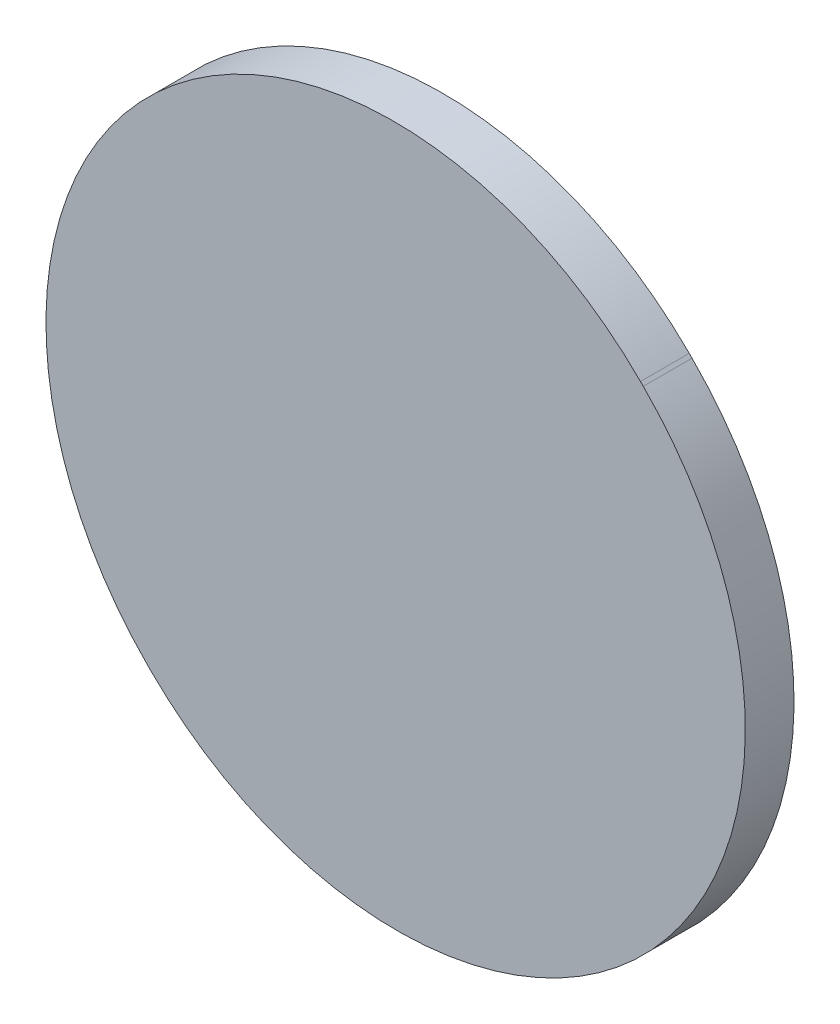
ISO-10303-21;
HEADER;
FILE_DESCRIPTION(('STEP AP214'),'2;1');
FILE_NAME('part.step','',(''),(''),'','','');
FILE_SCHEMA(('AUTOMOTIVE_DESIGN { 1 0 10303 214 1 1 1 1 }'));
ENDSEC;
DATA;
#1=APPLICATION_CONTEXT('core data for automotive mechanical design processes');
#2=APPLICATION_PROTOCOL_DEFINITION('international standard','automotive_design',2000,#1);
#3=PRODUCT_CONTEXT('',#1,'mechanical');
#4=PRODUCT('Part','Part','',(#3));
#5=PRODUCT_RELATED_PRODUCT_CATEGORY('part','',(#4));
#6=PRODUCT_DEFINITION_FORMATION('','',#4);
#7=PRODUCT_DEFINITION_CONTEXT('part definition',#1,'design');
#8=PRODUCT_DEFINITION('design','',#6,#7);
#9=PRODUCT_DEFINITION_SHAPE('','',#8);
#10=(LENGTH_UNIT() NAMED_UNIT(*) SI_UNIT(.MILLI.,.METRE.));
#11=(NAMED_UNIT(*) PLANE_ANGLE_UNIT() SI_UNIT($,.RADIAN.));
#12=(NAMED_UNIT(*) SI_UNIT($,.STERADIAN.) SOLID_ANGLE_UNIT());
#13=UNCERTAINTY_MEASURE_WITH_UNIT(LENGTH_MEASURE(1.E-05),#10,'distance_accuracy_value','');
#14=(GEOMETRIC_REPRESENTATION_CONTEXT(3) GLOBAL_UNCERTAINTY_ASSIGNED_CONTEXT((#13)) GLOBAL_UNIT_ASSIGNED_CONTEXT((#10,
#11,#12)) REPRESENTATION_CONTEXT('',''));
#15=CARTESIAN_POINT('',(0.,0.,0.));
#16=DIRECTION('',(0.,0.,1.));
#17=DIRECTION('',(1.,0.,0.));
#18=AXIS2_PLACEMENT_3D('',#15,#16,#17);
#19=CARTESIAN_POINT('',(132.133223,-112.724776,1.635));
#20=DIRECTION('',(0.,0.,1.));
#21=DIRECTION('',(1.,0.,0.));
#22=AXIS2_PLACEMENT_3D('',#19,#20,#21);
#23=PLANE('',#22);
#24=DIRECTION('',(0.707106781189048,-0.707106781184048,0.));
#25=VECTOR('',#24,1.);
#26=CARTESIAN_POINT('',(132.133223,-112.724776,1.635));
#27=LINE('',#26,#25);
#28=CARTESIAN_POINT('',(132.133223,-112.724776,1.635));
#29=VERTEX_POINT('',#28);
#30=CARTESIAN_POINT('',(132.135223,-112.726776,1.635));
#31=VERTEX_POINT('',#30);
#32=EDGE_CURVE('E95',#29,#31,#27,.T.);
#33=ORIENTED_EDGE('',*,*,#32,.T.);
#34=CARTESIAN_POINT('',(132.3119995,-112.5499995,1.635));
#35=DIRECTION('',(0.,0.,1.));
#36=DIRECTION('',(-0.707106781186548,-0.707106781186548,0.));
#37=AXIS2_PLACEMENT_3D('',#34,#35,#36);
#38=CIRCLE('',#37,0.249999723809);
#39=CARTESIAN_POINT('',(132.488776,-112.373223,1.635));
#40=VERTEX_POINT('',#39);
#41=EDGE_CURVE('E90',#31,#40,#38,.T.);
#42=ORIENTED_EDGE('',*,*,#41,.T.);
#43=DIRECTION('',(-0.707106781189048,0.707106781184048,0.));
#44=VECTOR('',#43,1.);
#45=CARTESIAN_POINT('',(132.488776,-112.373223,1.635));
#46=LINE('',#45,#44);
#47=CARTESIAN_POINT('',(132.486776,-112.371223,1.635));
#48=VERTEX_POINT('',#47);
#49=EDGE_CURVE('E57',#40,#48,#46,.T.);
#50=ORIENTED_EDGE('',*,*,#49,.T.);
#51=CARTESIAN_POINT('',(132.3099995,-112.5479995,1.635));
#52=DIRECTION('',(0.,0.,1.));
#53=DIRECTION('',(0.707106781186548,0.707106781186548,0.));
#54=AXIS2_PLACEMENT_3D('',#51,#52,#53);
#55=CIRCLE('',#54,0.249999723809);
#56=EDGE_CURVE('E11',#48,#29,#55,.T.);
#57=ORIENTED_EDGE('',*,*,#56,.T.);
#58=EDGE_LOOP('',(#33,#42,#50,#57));
#59=FACE_BOUND('',#58,.T.);
#60=ADVANCED_FACE('F17',(#59),#23,.T.);
#61=CARTESIAN_POINT('',(132.133223,-112.724776,1.6));
#62=DIRECTION('',(0.,0.,1.));
#63=DIRECTION('',(1.,0.,0.));
#64=AXIS2_PLACEMENT_3D('',#61,#62,#63);
#65=PLANE('',#64);
#66=CARTESIAN_POINT('',(132.3099995,-112.5479995,1.6));
#67=DIRECTION('',(0.,0.,1.));
#68=DIRECTION('',(0.707106781186548,0.707106781186548,0.));
#69=AXIS2_PLACEMENT_3D('',#66,#67,#68);
#70=CIRCLE('',#69,0.249999723809);
#71=CARTESIAN_POINT('',(132.486776,-112.371223,1.6));
#72=VERTEX_POINT('',#71);
#73=CARTESIAN_POINT('',(132.133223,-112.724776,1.6));
#74=VERTEX_POINT('',#73);
#75=EDGE_CURVE('E26',#72,#74,#70,.T.);
#76=ORIENTED_EDGE('',*,*,#75,.F.);
#77=DIRECTION('',(-0.707106781189048,0.707106781184048,0.));
#78=VECTOR('',#77,1.);
#79=CARTESIAN_POINT('',(132.488776,-112.373223,1.6));
#80=LINE('',#79,#78);
#81=CARTESIAN_POINT('',(132.488776,-112.373223,1.6));
#82=VERTEX_POINT('',#81);
#83=EDGE_CURVE('E66',#82,#72,#80,.T.);
#84=ORIENTED_EDGE('',*,*,#83,.F.);
#85=CARTESIAN_POINT('',(132.3119995,-112.5499995,1.6));
#86=DIRECTION('',(0.,0.,1.));
#87=DIRECTION('',(-0.707106781186548,-0.707106781186548,0.));
#88=AXIS2_PLACEMENT_3D('',#85,#86,#87);
#89=CIRCLE('',#88,0.249999723809);
#90=CARTESIAN_POINT('',(132.135223,-112.726776,1.6));
#91=VERTEX_POINT('',#90);
#92=EDGE_CURVE('E76',#91,#82,#89,.T.);
#93=ORIENTED_EDGE('',*,*,#92,.F.);
#94=DIRECTION('',(0.707106781189048,-0.707106781184048,0.));
#95=VECTOR('',#94,1.);
#96=CARTESIAN_POINT('',(132.133223,-112.724776,1.6));
#97=LINE('',#96,#95);
#98=EDGE_CURVE('E80',#74,#91,#97,.T.);
#99=ORIENTED_EDGE('',*,*,#98,.F.);
#100=EDGE_LOOP('',(#76,#84,#93,#99));
#101=FACE_BOUND('',#100,.T.);
#102=ADVANCED_FACE('F78',(#101),#65,.F.);
#103=CARTESIAN_POINT('',(132.3099995,-112.5479995,1.6));
#104=DIRECTION('',(0.,0.,-1.));
#105=DIRECTION('',(0.707106781186548,0.707106781186548,0.));
#106=AXIS2_PLACEMENT_3D('',#103,#104,#105);
#107=CYLINDRICAL_SURFACE('',#106,0.249999723809);
#108=ORIENTED_EDGE('',*,*,#75,.T.);
#109=DIRECTION('',(0.,0.,1.));
#110=VECTOR('',#109,1.);
#111=CARTESIAN_POINT('',(132.133223,-112.724776,1.6));
#112=LINE('',#111,#110);
#113=EDGE_CURVE('E85',#74,#29,#112,.T.);
#114=ORIENTED_EDGE('',*,*,#113,.T.);
#115=ORIENTED_EDGE('',*,*,#56,.F.);
#116=DIRECTION('',(0.,0.,1.));
#117=VECTOR('',#116,1.);
#118=CARTESIAN_POINT('',(132.486776,-112.371223,1.6));
#119=LINE('',#118,#117);
#120=EDGE_CURVE('E104',#72,#48,#119,.T.);
#121=ORIENTED_EDGE('',*,*,#120,.F.);
#122=EDGE_LOOP('',(#108,#114,#115,#121));
#123=FACE_BOUND('',#122,.T.);
#124=ADVANCED_FACE('F180',(#123),#107,.T.);
#125=CARTESIAN_POINT('',(132.488776,-112.373223,1.6));
#126=DIRECTION('',(-0.707106781184048,-0.707106781189048,0.));
#127=DIRECTION('',(-0.707106781189048,0.707106781184048,0.));
#128=AXIS2_PLACEMENT_3D('',#125,#126,#127);
#129=PLANE('',#128);
#130=ORIENTED_EDGE('',*,*,#83,.T.);
#131=ORIENTED_EDGE('',*,*,#120,.T.);
#132=ORIENTED_EDGE('',*,*,#49,.F.);
#133=DIRECTION('',(0.,0.,1.));
#134=VECTOR('',#133,1.);
#135=CARTESIAN_POINT('',(132.488776,-112.373223,1.6));
#136=LINE('',#135,#134);
#137=EDGE_CURVE('E84',#82,#40,#136,.T.);
#138=ORIENTED_EDGE('',*,*,#137,.F.);
#139=EDGE_LOOP('',(#130,#131,#132,#138));
#140=FACE_BOUND('',#139,.T.);
#141=ADVANCED_FACE('F171',(#140),#129,.F.);
#142=CARTESIAN_POINT('',(132.3119995,-112.5499995,1.6));
#143=DIRECTION('',(0.,0.,-1.));
#144=DIRECTION('',(-0.707106781186548,-0.707106781186548,0.));
#145=AXIS2_PLACEMENT_3D('',#142,#143,#144);
#146=CYLINDRICAL_SURFACE('',#145,0.249999723809);
#147=ORIENTED_EDGE('',*,*,#92,.T.);
#148=ORIENTED_EDGE('',*,*,#137,.T.);
#149=ORIENTED_EDGE('',*,*,#41,.F.);
#150=DIRECTION('',(0.,0.,1.));
#151=VECTOR('',#150,1.);
#152=CARTESIAN_POINT('',(132.135223,-112.726776,1.6));
#153=LINE('',#152,#151);
#154=EDGE_CURVE('E88',#91,#31,#153,.T.);
#155=ORIENTED_EDGE('',*,*,#154,.F.);
#156=EDGE_LOOP('',(#147,#148,#149,#155));
#157=FACE_BOUND('',#156,.T.);
#158=ADVANCED_FACE('F89',(#157),#146,.T.);
#159=CARTESIAN_POINT('',(132.133223,-112.724776,1.6));
#160=DIRECTION('',(0.707106781184048,0.707106781189048,0.));
#161=DIRECTION('',(0.,0.,-1.));
#162=AXIS2_PLACEMENT_3D('',#159,#160,#161);
#163=PLANE('',#162);
#164=ORIENTED_EDGE('',*,*,#98,.T.);
#165=ORIENTED_EDGE('',*,*,#154,.T.);
#166=ORIENTED_EDGE('',*,*,#32,.F.);
#167=ORIENTED_EDGE('',*,*,#113,.F.);
#168=EDGE_LOOP('',(#164,#165,#166,#167));
#169=FACE_BOUND('',#168,.T.);
#170=ADVANCED_FACE('F97',(#169),#163,.F.);
#171=CLOSED_SHELL('',(#60,#102,#124,#141,#158,#170));
#172=MANIFOLD_SOLID_BREP('B1',#171);
#173=ADVANCED_BREP_SHAPE_REPRESENTATION('',(#18,#172),#14);
#174=SHAPE_DEFINITION_REPRESENTATION(#9,#173);
ENDSEC;
END-ISO-10303-21;
